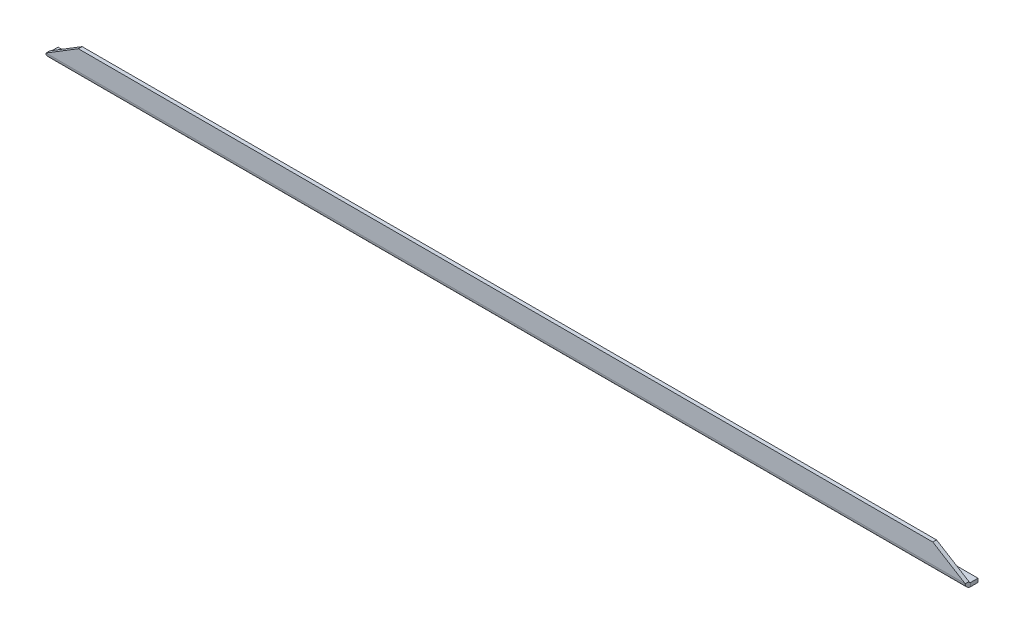
ISO-10303-21;
HEADER;
FILE_DESCRIPTION(('STEP AP214'),'2;1');
FILE_NAME('part.step','',(''),(''),'','','');
FILE_SCHEMA(('AUTOMOTIVE_DESIGN { 1 0 10303 214 1 1 1 1 }'));
ENDSEC;
DATA;
#1=APPLICATION_CONTEXT('core data for automotive mechanical design processes');
#2=APPLICATION_PROTOCOL_DEFINITION('international standard','automotive_design',2000,#1);
#3=PRODUCT_CONTEXT('',#1,'mechanical');
#4=PRODUCT('Part','Part','',(#3));
#5=PRODUCT_RELATED_PRODUCT_CATEGORY('part','',(#4));
#6=PRODUCT_DEFINITION_FORMATION('','',#4);
#7=PRODUCT_DEFINITION_CONTEXT('part definition',#1,'design');
#8=PRODUCT_DEFINITION('design','',#6,#7);
#9=PRODUCT_DEFINITION_SHAPE('','',#8);
#10=(LENGTH_UNIT() NAMED_UNIT(*) SI_UNIT(.MILLI.,.METRE.));
#11=(NAMED_UNIT(*) PLANE_ANGLE_UNIT() SI_UNIT($,.RADIAN.));
#12=(NAMED_UNIT(*) SI_UNIT($,.STERADIAN.) SOLID_ANGLE_UNIT());
#13=UNCERTAINTY_MEASURE_WITH_UNIT(LENGTH_MEASURE(1.E-05),#10,'distance_accuracy_value','');
#14=(GEOMETRIC_REPRESENTATION_CONTEXT(3) GLOBAL_UNCERTAINTY_ASSIGNED_CONTEXT((#13)) GLOBAL_UNIT_ASSIGNED_CONTEXT((#10,
#11,#12)) REPRESENTATION_CONTEXT('',''));
#15=CARTESIAN_POINT('',(0.,0.,0.));
#16=DIRECTION('',(0.,0.,1.));
#17=DIRECTION('',(1.,0.,0.));
#18=AXIS2_PLACEMENT_3D('',#15,#16,#17);
#19=CARTESIAN_POINT('',(786.671666666667,-1197.,866.999999999999));
#20=DIRECTION('',(0.,1.,0.));
#21=DIRECTION('',(0.,0.,1.));
#22=AXIS2_PLACEMENT_3D('',#19,#20,#21);
#23=PLANE('',#22);
#24=DIRECTION('',(0.,0.,-1.));
#25=VECTOR('',#24,1.);
#26=CARTESIAN_POINT('',(417.043773447854,-1197.,866.999999999999));
#27=LINE('',#26,#25);
#28=CARTESIAN_POINT('',(417.043773447854,-1197.,859.999999999999));
#29=VERTEX_POINT('',#28);
#30=CARTESIAN_POINT('',(417.043773447854,-1197.,865.999999999999));
#31=VERTEX_POINT('',#30);
#32=EDGE_CURVE('E185',#29,#31,#27,.F.);
#33=ORIENTED_EDGE('',*,*,#32,.T.);
#34=DIRECTION('',(-1.,0.,0.));
#35=VECTOR('',#34,1.);
#36=CARTESIAN_POINT('',(417.043773447854,-1197.,865.999999999999));
#37=LINE('',#36,#35);
#38=CARTESIAN_POINT('',(1156.29955988548,-1197.,865.999999999999));
#39=VERTEX_POINT('',#38);
#40=EDGE_CURVE('E196',#31,#39,#37,.F.);
#41=ORIENTED_EDGE('',*,*,#40,.T.);
#42=DIRECTION('',(0.,0.,-1.));
#43=VECTOR('',#42,1.);
#44=CARTESIAN_POINT('',(1156.29955988548,-1197.,866.999999999999));
#45=LINE('',#44,#43);
#46=CARTESIAN_POINT('',(1156.29955988548,-1197.,860.));
#47=VERTEX_POINT('',#46);
#48=EDGE_CURVE('E73',#47,#39,#45,.F.);
#49=ORIENTED_EDGE('',*,*,#48,.F.);
#50=DIRECTION('',(1.,0.,0.));
#51=VECTOR('',#50,1.);
#52=CARTESIAN_POINT('',(1160.00666666667,-1197.,859.999999999999));
#53=LINE('',#52,#51);
#54=EDGE_CURVE('E173',#29,#47,#53,.T.);
#55=ORIENTED_EDGE('',*,*,#54,.F.);
#56=EDGE_LOOP('',(#33,#41,#49,#55));
#57=FACE_BOUND('',#56,.T.);
#58=ADVANCED_FACE('F48',(#57),#23,.T.);
#59=CARTESIAN_POINT('',(417.043773447854,281.560269696862,867.));
#60=DIRECTION('',(1.,0.,0.));
#61=DIRECTION('',(0.,1.,0.));
#62=AXIS2_PLACEMENT_3D('',#59,#60,#61);
#63=PLANE('',#62);
#64=DIRECTION('',(0.,-1.,0.));
#65=VECTOR('',#64,1.);
#66=CARTESIAN_POINT('',(417.043773447854,281.560269696862,860.));
#67=LINE('',#66,#65);
#68=CARTESIAN_POINT('',(417.043773447854,-1200.,860.));
#69=VERTEX_POINT('',#68);
#70=EDGE_CURVE('E175',#29,#69,#67,.T.);
#71=ORIENTED_EDGE('',*,*,#70,.T.);
#72=DIRECTION('',(0.,0.,1.));
#73=VECTOR('',#72,1.);
#74=CARTESIAN_POINT('',(417.043773447854,-1200.,866.999999999999));
#75=LINE('',#74,#73);
#76=CARTESIAN_POINT('',(417.043773447854,-1200.,865.999999999999));
#77=VERTEX_POINT('',#76);
#78=EDGE_CURVE('E180',#69,#77,#75,.T.);
#79=ORIENTED_EDGE('',*,*,#78,.T.);
#80=CARTESIAN_POINT('',(417.043773447854,-1197.,866.));
#81=CARTESIAN_POINT('',(417.043773447854,-1200.,865.999999999999));
#82=B_SPLINE_CURVE_WITH_KNOTS('',1,(#80,#81),.UNSPECIFIED.,.F.,.F.,(2,2),(0.,1.),.UNSPECIFIED.);
#83=EDGE_CURVE('E13',#31,#77,#82,.T.);
#84=ORIENTED_EDGE('',*,*,#83,.F.);
#85=ORIENTED_EDGE('',*,*,#32,.F.);
#86=EDGE_LOOP('',(#71,#79,#84,#85));
#87=FACE_BOUND('',#86,.T.);
#88=ADVANCED_FACE('F50',(#87),#63,.F.);
#89=CARTESIAN_POINT('',(1156.29955988548,281.560269696862,867.));
#90=DIRECTION('',(1.,0.,0.));
#91=DIRECTION('',(0.,1.,0.));
#92=AXIS2_PLACEMENT_3D('',#89,#90,#91);
#93=PLANE('',#92);
#94=DIRECTION('',(0.,0.,1.));
#95=VECTOR('',#94,1.);
#96=CARTESIAN_POINT('',(1156.29955988548,-1200.,866.999999999999));
#97=LINE('',#96,#95);
#98=CARTESIAN_POINT('',(1156.29955988548,-1200.,865.999999999999));
#99=VERTEX_POINT('',#98);
#100=CARTESIAN_POINT('',(1156.29955988548,-1200.,859.999999999999));
#101=VERTEX_POINT('',#100);
#102=EDGE_CURVE('E172',#99,#101,#97,.F.);
#103=ORIENTED_EDGE('',*,*,#102,.T.);
#104=DIRECTION('',(0.,-1.,0.));
#105=VECTOR('',#104,1.);
#106=CARTESIAN_POINT('',(1156.29955988548,281.560269696862,860.));
#107=LINE('',#106,#105);
#108=EDGE_CURVE('E177',#47,#101,#107,.T.);
#109=ORIENTED_EDGE('',*,*,#108,.F.);
#110=ORIENTED_EDGE('',*,*,#48,.T.);
#111=CARTESIAN_POINT('',(1156.29955988548,-1200.,865.999999999999));
#112=CARTESIAN_POINT('',(1156.29955988548,-1197.,866.));
#113=B_SPLINE_CURVE_WITH_KNOTS('',1,(#111,#112),.UNSPECIFIED.,.F.,.F.,(2,2),(0.,1.),.UNSPECIFIED.);
#114=EDGE_CURVE('E58',#39,#99,#113,.F.);
#115=ORIENTED_EDGE('',*,*,#114,.T.);
#116=EDGE_LOOP('',(#103,#109,#110,#115));
#117=FACE_BOUND('',#116,.T.);
#118=ADVANCED_FACE('F217',(#117),#93,.T.);
#119=CARTESIAN_POINT('',(1160.00666666667,281.560269696862,860.));
#120=DIRECTION('',(0.,0.,-1.));
#121=DIRECTION('',(1.,0.,0.));
#122=AXIS2_PLACEMENT_3D('',#119,#120,#121);
#123=PLANE('',#122);
#124=DIRECTION('',(1.,0.,0.));
#125=VECTOR('',#124,1.);
#126=CARTESIAN_POINT('',(786.671666666667,-1200.,859.999999999999));
#127=LINE('',#126,#125);
#128=EDGE_CURVE('E65',#101,#69,#127,.F.);
#129=ORIENTED_EDGE('',*,*,#128,.T.);
#130=ORIENTED_EDGE('',*,*,#70,.F.);
#131=ORIENTED_EDGE('',*,*,#54,.T.);
#132=ORIENTED_EDGE('',*,*,#108,.T.);
#133=EDGE_LOOP('',(#129,#130,#131,#132));
#134=FACE_BOUND('',#133,.T.);
#135=ADVANCED_FACE('F226',(#134),#123,.T.);
#136=CARTESIAN_POINT('',(786.671666666667,-1200.,866.999999999999));
#137=DIRECTION('',(0.,1.,0.));
#138=DIRECTION('',(0.,0.,1.));
#139=AXIS2_PLACEMENT_3D('',#136,#137,#138);
#140=PLANE('',#139);
#141=ORIENTED_EDGE('',*,*,#128,.F.);
#142=ORIENTED_EDGE('',*,*,#102,.F.);
#143=DIRECTION('',(-1.,0.,0.));
#144=VECTOR('',#143,1.);
#145=CARTESIAN_POINT('',(417.043773447854,-1200.,865.999999999999));
#146=LINE('',#145,#144);
#147=EDGE_CURVE('E144',#77,#99,#146,.F.);
#148=ORIENTED_EDGE('',*,*,#147,.F.);
#149=ORIENTED_EDGE('',*,*,#78,.F.);
#150=EDGE_LOOP('',(#141,#142,#148,#149));
#151=FACE_BOUND('',#150,.T.);
#152=ADVANCED_FACE('F229',(#151),#140,.F.);
#153=CARTESIAN_POINT('',(443.336666666667,-1180.,-610.686528191958));
#154=DIRECTION('',(0.,-1.,0.));
#155=DIRECTION('',(0.,0.,-1.));
#156=AXIS2_PLACEMENT_3D('',#153,#154,#155);
#157=PLANE('',#156);
#158=DIRECTION('',(1.,0.,0.));
#159=VECTOR('',#158,1.);
#160=CARTESIAN_POINT('',(786.671666666667,-1180.,869.999999999999));
#161=LINE('',#160,#159);
#162=CARTESIAN_POINT('',(1130.00666666667,-1180.,869.999999999999));
#163=VERTEX_POINT('',#162);
#164=CARTESIAN_POINT('',(443.336666666667,-1180.,869.999999999999));
#165=VERTEX_POINT('',#164);
#166=EDGE_CURVE('E264',#163,#165,#161,.F.);
#167=ORIENTED_EDGE('',*,*,#166,.F.);
#168=DIRECTION('',(0.,0.,1.));
#169=VECTOR('',#168,1.);
#170=CARTESIAN_POINT('',(1130.00666666667,-1180.,-610.686528191958));
#171=LINE('',#170,#169);
#172=CARTESIAN_POINT('',(1130.00666666667,-1180.,867.));
#173=VERTEX_POINT('',#172);
#174=EDGE_CURVE('E161',#173,#163,#171,.T.);
#175=ORIENTED_EDGE('',*,*,#174,.F.);
#176=DIRECTION('',(1.,0.,0.));
#177=VECTOR('',#176,1.);
#178=CARTESIAN_POINT('',(443.336666666667,-1180.,867.));
#179=LINE('',#178,#177);
#180=CARTESIAN_POINT('',(443.336666666667,-1180.,867.));
#181=VERTEX_POINT('',#180);
#182=EDGE_CURVE('E270',#181,#173,#179,.T.);
#183=ORIENTED_EDGE('',*,*,#182,.F.);
#184=DIRECTION('',(0.,0.,1.));
#185=VECTOR('',#184,1.);
#186=CARTESIAN_POINT('',(443.336666666667,-1180.,-610.686528191958));
#187=LINE('',#186,#185);
#188=EDGE_CURVE('E132',#181,#165,#187,.T.);
#189=ORIENTED_EDGE('',*,*,#188,.T.);
#190=EDGE_LOOP('',(#167,#175,#183,#189));
#191=FACE_BOUND('',#190,.T.);
#192=ADVANCED_FACE('F233',(#191),#157,.F.);
#193=CARTESIAN_POINT('',(-1156.00333333333,886.,867.));
#194=DIRECTION('',(0.,0.,-1.));
#195=DIRECTION('',(-1.,0.,0.));
#196=AXIS2_PLACEMENT_3D('',#193,#194,#195);
#197=PLANE('',#196);
#198=ORIENTED_EDGE('',*,*,#182,.T.);
#199=DIRECTION('',(0.851658316704544,-0.524097425664335,0.));
#200=VECTOR('',#199,1.);
#201=CARTESIAN_POINT('',(423.467546494993,-745.20669527897,867.));
#202=LINE('',#201,#200);
#203=CARTESIAN_POINT('',(1156.00666666667,-1196.,867.));
#204=VERTEX_POINT('',#203);
#205=EDGE_CURVE('E268',#173,#204,#202,.T.);
#206=ORIENTED_EDGE('',*,*,#205,.T.);
#207=DIRECTION('',(1.,0.,0.));
#208=VECTOR('',#207,1.);
#209=CARTESIAN_POINT('',(786.671666666667,-1196.,867.));
#210=LINE('',#209,#208);
#211=CARTESIAN_POINT('',(417.336666666667,-1196.,866.999999999999));
#212=VERTEX_POINT('',#211);
#213=EDGE_CURVE('E133',#212,#204,#210,.T.);
#214=ORIENTED_EDGE('',*,*,#213,.F.);
#215=DIRECTION('',(-0.851658316704543,-0.524097425664336,0.));
#216=VECTOR('',#215,1.);
#217=CARTESIAN_POINT('',(1149.87578683834,-745.206695278968,867.));
#218=LINE('',#217,#216);
#219=EDGE_CURVE('E261',#181,#212,#218,.T.);
#220=ORIENTED_EDGE('',*,*,#219,.F.);
#221=EDGE_LOOP('',(#198,#206,#214,#220));
#222=FACE_BOUND('',#221,.T.);
#223=ADVANCED_FACE('F244',(#222),#197,.T.);
#224=CARTESIAN_POINT('',(1149.87578683834,-745.206695278968,-610.686528191958));
#225=DIRECTION('',(-0.524097425664336,0.851658316704543,0.));
#226=DIRECTION('',(-0.851658316704543,-0.524097425664336,0.));
#227=AXIS2_PLACEMENT_3D('',#224,#225,#226);
#228=PLANE('',#227);
#229=CARTESIAN_POINT('',(417.336666666667,-1196.,869.999999999999));
#230=CARTESIAN_POINT('',(417.336666666667,-1196.,866.999999999999));
#231=B_SPLINE_CURVE_WITH_KNOTS('',1,(#229,#230),.UNSPECIFIED.,.F.,.F.,(2,2),(0.,1.),.UNSPECIFIED.);
#232=CARTESIAN_POINT('',(417.336666666667,-1196.,870.));
#233=VERTEX_POINT('',#232);
#234=EDGE_CURVE('E265',#212,#233,#231,.F.);
#235=ORIENTED_EDGE('',*,*,#234,.T.);
#236=DIRECTION('',(-0.851658316704543,-0.524097425664336,0.));
#237=VECTOR('',#236,1.);
#238=CARTESIAN_POINT('',(1149.87578683834,-745.206695278968,869.999999999999));
#239=LINE('',#238,#237);
#240=EDGE_CURVE('E155',#165,#233,#239,.T.);
#241=ORIENTED_EDGE('',*,*,#240,.F.);
#242=ORIENTED_EDGE('',*,*,#188,.F.);
#243=ORIENTED_EDGE('',*,*,#219,.T.);
#244=EDGE_LOOP('',(#235,#241,#242,#243));
#245=FACE_BOUND('',#244,.T.);
#246=ADVANCED_FACE('F240',(#245),#228,.T.);
#247=CARTESIAN_POINT('',(786.671666666667,-155.,869.999999999999));
#248=DIRECTION('',(0.,0.,1.));
#249=DIRECTION('',(1.,0.,0.));
#250=AXIS2_PLACEMENT_3D('',#247,#248,#249);
#251=PLANE('',#250);
#252=DIRECTION('',(0.851658316704544,-0.524097425664335,0.));
#253=VECTOR('',#252,1.);
#254=CARTESIAN_POINT('',(423.467546494993,-745.20669527897,869.999999999999));
#255=LINE('',#254,#253);
#256=CARTESIAN_POINT('',(1156.00666666667,-1196.,869.999999999999));
#257=VERTEX_POINT('',#256);
#258=EDGE_CURVE('E152',#163,#257,#255,.T.);
#259=ORIENTED_EDGE('',*,*,#258,.F.);
#260=ORIENTED_EDGE('',*,*,#166,.T.);
#261=ORIENTED_EDGE('',*,*,#240,.T.);
#262=DIRECTION('',(1.,0.,0.));
#263=VECTOR('',#262,1.);
#264=CARTESIAN_POINT('',(786.671666666667,-1196.,869.999999999999));
#265=LINE('',#264,#263);
#266=EDGE_CURVE('E142',#233,#257,#265,.T.);
#267=ORIENTED_EDGE('',*,*,#266,.T.);
#268=EDGE_LOOP('',(#259,#260,#261,#267));
#269=FACE_BOUND('',#268,.T.);
#270=ADVANCED_FACE('F151',(#269),#251,.T.);
#271=CARTESIAN_POINT('',(423.467546494993,-745.20669527897,-610.686528191958));
#272=DIRECTION('',(-0.524097425664335,-0.851658316704544,0.));
#273=DIRECTION('',(0.851658316704544,-0.524097425664335,0.));
#274=AXIS2_PLACEMENT_3D('',#271,#272,#273);
#275=PLANE('',#274);
#276=ORIENTED_EDGE('',*,*,#258,.T.);
#277=CARTESIAN_POINT('',(1156.00666666667,-1196.,867.));
#278=CARTESIAN_POINT('',(1156.00666666667,-1196.,869.999999999999));
#279=B_SPLINE_CURVE_WITH_KNOTS('',1,(#277,#278),.UNSPECIFIED.,.F.,.F.,(2,2),(0.,1.),.UNSPECIFIED.);
#280=EDGE_CURVE('E116',#204,#257,#279,.T.);
#281=ORIENTED_EDGE('',*,*,#280,.F.);
#282=ORIENTED_EDGE('',*,*,#205,.F.);
#283=ORIENTED_EDGE('',*,*,#174,.T.);
#284=EDGE_LOOP('',(#276,#281,#282,#283));
#285=FACE_BOUND('',#284,.T.);
#286=ADVANCED_FACE('F159',(#285),#275,.F.);
#287=CARTESIAN_POINT('',(1156.00666666667,-1196.,869.999999999999));
#288=CARTESIAN_POINT('',(1156.03107882601,-1196.52369297434,869.999999999999));
#289=CARTESIAN_POINT('',(1156.05548220314,-1197.04699153744,869.895890706673));
#290=CARTESIAN_POINT('',(1156.10429773961,-1198.01447592148,869.495145553416));
#291=CARTESIAN_POINT('',(1156.12870550784,-1198.4581868799,869.198667369592));
#292=CARTESIAN_POINT('',(1156.17752104431,-1199.19866736959,868.458186879899));
#293=CARTESIAN_POINT('',(1156.20192881254,-1199.49514555342,868.014475921483));
#294=CARTESIAN_POINT('',(1156.25074434901,-1199.89589070667,867.046991537436));
#295=CARTESIAN_POINT('',(1156.27514772613,-1200.,866.523692974337));
#296=CARTESIAN_POINT('',(1156.29955988548,-1200.,865.999999999999));
#297=CARTESIAN_POINT('',(1156.00666666667,-1196.,867.));
#298=CARTESIAN_POINT('',(1156.03107868769,-1196.13092250178,867.));
#299=CARTESIAN_POINT('',(1156.05548220314,-1196.26174788436,866.973972676668));
#300=CARTESIAN_POINT('',(1156.10429773961,-1196.50361898037,866.873786388354));
#301=CARTESIAN_POINT('',(1156.12870550784,-1196.61454671997,866.799666842398));
#302=CARTESIAN_POINT('',(1156.17752104431,-1196.7996668424,866.614546719975));
#303=CARTESIAN_POINT('',(1156.20192881254,-1196.87378638835,866.503618980371));
#304=CARTESIAN_POINT('',(1156.25074434901,-1196.97397267667,866.261747884359));
#305=CARTESIAN_POINT('',(1156.27514786445,-1197.,866.130922501775));
#306=CARTESIAN_POINT('',(1156.29955988548,-1197.,866.));
#307=B_SPLINE_SURFACE_WITH_KNOTS('',1,3,((#287,#288,#289,#290,#291,#292,#293,#294,#295,#296),
(#297,#298,#299,#300,#301,#302,#303,#304,#305,#306)),.UNSPECIFIED.,.F.,.F.,.F.,(2,2),(4,2,2,2,
4),(0.,1.),(0.,0.25,0.5,0.75,1.),.UNSPECIFIED.);
#308=CARTESIAN_POINT('',(1156.29955988548,-1197.,866.));
#309=CARTESIAN_POINT('',(1156.27514786445,-1197.,866.130922501775));
#310=CARTESIAN_POINT('',(1156.25074434901,-1196.97397267667,866.261747884359));
#311=CARTESIAN_POINT('',(1156.20192881254,-1196.87378638835,866.503618980371));
#312=CARTESIAN_POINT('',(1156.17752104431,-1196.7996668424,866.614546719975));
#313=CARTESIAN_POINT('',(1156.12870550784,-1196.61454671997,866.799666842398));
#314=CARTESIAN_POINT('',(1156.10429773961,-1196.50361898037,866.873786388354));
#315=CARTESIAN_POINT('',(1156.05548220314,-1196.26174788436,866.973972676668));
#316=CARTESIAN_POINT('',(1156.03107868769,-1196.13092250178,867.));
#317=CARTESIAN_POINT('',(1156.00666666667,-1196.,867.));
#318=B_SPLINE_CURVE_WITH_KNOTS('',3,(#308,#309,#310,#311,#312,#313,#314,#315,#316,#317),
.UNSPECIFIED.,.F.,.F.,(4,2,2,2,4),(0.,0.25,0.5,0.75,1.),.UNSPECIFIED.);
#319=EDGE_CURVE('E124',#204,#39,#318,.F.);
#320=CARTESIAN_POINT('',(1156.00666666667,-1196.,869.999999999999));
#321=CARTESIAN_POINT('',(1156.03107882601,-1196.52369297434,869.999999999999));
#322=CARTESIAN_POINT('',(1156.05548220314,-1197.04699153744,869.895890706673));
#323=CARTESIAN_POINT('',(1156.10429773961,-1198.01447592148,869.495145553416));
#324=CARTESIAN_POINT('',(1156.12870550784,-1198.4581868799,869.198667369592));
#325=CARTESIAN_POINT('',(1156.17752104431,-1199.19866736959,868.458186879899));
#326=CARTESIAN_POINT('',(1156.20192881254,-1199.49514555342,868.014475921483));
#327=CARTESIAN_POINT('',(1156.25074434901,-1199.89589070667,867.046991537436));
#328=CARTESIAN_POINT('',(1156.27514772613,-1200.,866.523692974337));
#329=CARTESIAN_POINT('',(1156.29955988548,-1200.,865.999999999999));
#330=B_SPLINE_CURVE_WITH_KNOTS('',3,(#320,#321,#322,#323,#324,#325,#326,#327,#328,#329),
.UNSPECIFIED.,.F.,.F.,(4,2,2,2,4),(0.,0.25,0.5,0.75,1.),.UNSPECIFIED.);
#331=EDGE_CURVE('E121',#257,#99,#330,.T.);
#332=ORIENTED_EDGE('',*,*,#114,.F.);
#333=ORIENTED_EDGE('',*,*,#319,.F.);
#334=ORIENTED_EDGE('',*,*,#280,.T.);
#335=ORIENTED_EDGE('',*,*,#331,.T.);
#336=EDGE_LOOP('',(#332,#333,#334,#335));
#337=FACE_BOUND('',#336,.T.);
#338=ADVANCED_FACE('F120',(#337),#307,.F.);
#339=CARTESIAN_POINT('',(417.043773447854,-1200.,865.999999999999));
#340=CARTESIAN_POINT('',(417.068185607201,-1200.,866.523692974337));
#341=CARTESIAN_POINT('',(417.092588984323,-1199.89589070667,867.046991537436));
#342=CARTESIAN_POINT('',(417.141404520792,-1199.49514555342,868.014475921483));
#343=CARTESIAN_POINT('',(417.165812289026,-1199.19866736959,868.458186879899));
#344=CARTESIAN_POINT('',(417.214627825495,-1198.4581868799,869.198667369592));
#345=CARTESIAN_POINT('',(417.23903559373,-1198.01447592148,869.495145553416));
#346=CARTESIAN_POINT('',(417.287851130198,-1197.04699153744,869.895890706672));
#347=CARTESIAN_POINT('',(417.312254507321,-1196.52369297434,869.999999999999));
#348=CARTESIAN_POINT('',(417.336666666667,-1196.,869.999999999999));
#349=CARTESIAN_POINT('',(417.043773447854,-1197.,866.));
#350=CARTESIAN_POINT('',(417.068185468882,-1197.,866.130922501775));
#351=CARTESIAN_POINT('',(417.092588984323,-1196.97397267667,866.261747884359));
#352=CARTESIAN_POINT('',(417.141404520792,-1196.87378638835,866.50361898037));
#353=CARTESIAN_POINT('',(417.165812289026,-1196.7996668424,866.614546719974));
#354=CARTESIAN_POINT('',(417.214627825495,-1196.61454671997,866.799666842398));
#355=CARTESIAN_POINT('',(417.23903559373,-1196.50361898037,866.873786388354));
#356=CARTESIAN_POINT('',(417.287851130198,-1196.26174788436,866.973972676668));
#357=CARTESIAN_POINT('',(417.31225464564,-1196.13092250177,866.999999999999));
#358=CARTESIAN_POINT('',(417.336666666667,-1196.,866.999999999999));
#359=B_SPLINE_SURFACE_WITH_KNOTS('',1,3,((#339,#340,#341,#342,#343,#344,#345,#346,#347,#348),
(#349,#350,#351,#352,#353,#354,#355,#356,#357,#358)),.UNSPECIFIED.,.F.,.F.,.F.,(2,2),(4,2,2,2,
4),(0.,1.),(0.,0.25,0.5,0.75,1.),.UNSPECIFIED.);
#360=CARTESIAN_POINT('',(417.336666666667,-1196.,866.999999999999));
#361=CARTESIAN_POINT('',(417.31225464564,-1196.13092250177,866.999999999999));
#362=CARTESIAN_POINT('',(417.287851130198,-1196.26174788436,866.973972676668));
#363=CARTESIAN_POINT('',(417.23903559373,-1196.50361898037,866.873786388354));
#364=CARTESIAN_POINT('',(417.214627825495,-1196.61454671997,866.799666842398));
#365=CARTESIAN_POINT('',(417.165812289026,-1196.7996668424,866.614546719974));
#366=CARTESIAN_POINT('',(417.141404520792,-1196.87378638835,866.50361898037));
#367=CARTESIAN_POINT('',(417.092588984323,-1196.97397267667,866.261747884359));
#368=CARTESIAN_POINT('',(417.068185468882,-1197.,866.130922501775));
#369=CARTESIAN_POINT('',(417.043773447854,-1197.,866.));
#370=B_SPLINE_CURVE_WITH_KNOTS('',3,(#360,#361,#362,#363,#364,#365,#366,#367,#368,#369),
.UNSPECIFIED.,.F.,.F.,(4,2,2,2,4),(0.,0.25,0.5,0.75,1.),.UNSPECIFIED.);
#371=EDGE_CURVE('E146',#31,#212,#370,.F.);
#372=CARTESIAN_POINT('',(417.043773447854,-1200.,865.999999999999));
#373=CARTESIAN_POINT('',(417.068185607201,-1200.,866.523692974337));
#374=CARTESIAN_POINT('',(417.092588984323,-1199.89589070667,867.046991537436));
#375=CARTESIAN_POINT('',(417.141404520792,-1199.49514555342,868.014475921483));
#376=CARTESIAN_POINT('',(417.165812289026,-1199.19866736959,868.458186879899));
#377=CARTESIAN_POINT('',(417.214627825495,-1198.4581868799,869.198667369592));
#378=CARTESIAN_POINT('',(417.23903559373,-1198.01447592148,869.495145553416));
#379=CARTESIAN_POINT('',(417.287851130198,-1197.04699153744,869.895890706672));
#380=CARTESIAN_POINT('',(417.312254507321,-1196.52369297434,869.999999999999));
#381=CARTESIAN_POINT('',(417.336666666667,-1196.,869.999999999999));
#382=B_SPLINE_CURVE_WITH_KNOTS('',3,(#372,#373,#374,#375,#376,#377,#378,#379,#380,#381),
.UNSPECIFIED.,.F.,.F.,(4,2,2,2,4),(0.,0.25,0.5,0.75,1.),.UNSPECIFIED.);
#383=EDGE_CURVE('E145',#77,#233,#382,.T.);
#384=ORIENTED_EDGE('',*,*,#371,.F.);
#385=ORIENTED_EDGE('',*,*,#83,.T.);
#386=ORIENTED_EDGE('',*,*,#383,.T.);
#387=ORIENTED_EDGE('',*,*,#234,.F.);
#388=EDGE_LOOP('',(#384,#385,#386,#387));
#389=FACE_BOUND('',#388,.T.);
#390=ADVANCED_FACE('F290',(#389),#359,.F.);
#391=CARTESIAN_POINT('',(1895.83758504868,-1196.,866.));
#392=DIRECTION('',(-1.,0.,0.));
#393=DIRECTION('',(0.,0.,1.));
#394=AXIS2_PLACEMENT_3D('',#391,#392,#393);
#395=CYLINDRICAL_SURFACE('',#394,3.99999999999959);
#396=ORIENTED_EDGE('',*,*,#266,.F.);
#397=ORIENTED_EDGE('',*,*,#383,.F.);
#398=ORIENTED_EDGE('',*,*,#147,.T.);
#399=ORIENTED_EDGE('',*,*,#331,.F.);
#400=EDGE_LOOP('',(#396,#397,#398,#399));
#401=FACE_BOUND('',#400,.T.);
#402=ADVANCED_FACE('F140',(#401),#395,.T.);
#403=CARTESIAN_POINT('',(1895.83758504868,-1196.,866.));
#404=DIRECTION('',(-1.,0.,0.));
#405=DIRECTION('',(0.,0.,1.));
#406=AXIS2_PLACEMENT_3D('',#403,#404,#405);
#407=CYLINDRICAL_SURFACE('',#406,0.999999999999809);
#408=ORIENTED_EDGE('',*,*,#213,.T.);
#409=ORIENTED_EDGE('',*,*,#319,.T.);
#410=ORIENTED_EDGE('',*,*,#40,.F.);
#411=ORIENTED_EDGE('',*,*,#371,.T.);
#412=EDGE_LOOP('',(#408,#409,#410,#411));
#413=FACE_BOUND('',#412,.T.);
#414=ADVANCED_FACE('F339',(#413),#407,.F.);
#415=CLOSED_SHELL('',(#58,#88,#118,#135,#152,#192,#223,#246,#270,#286,#338,#390,#402,#414));
#416=MANIFOLD_SOLID_BREP('B2',#415);
#417=ADVANCED_BREP_SHAPE_REPRESENTATION('',(#18,#416),#14);
#418=SHAPE_DEFINITION_REPRESENTATION(#9,#417);
ENDSEC;
END-ISO-10303-21;
